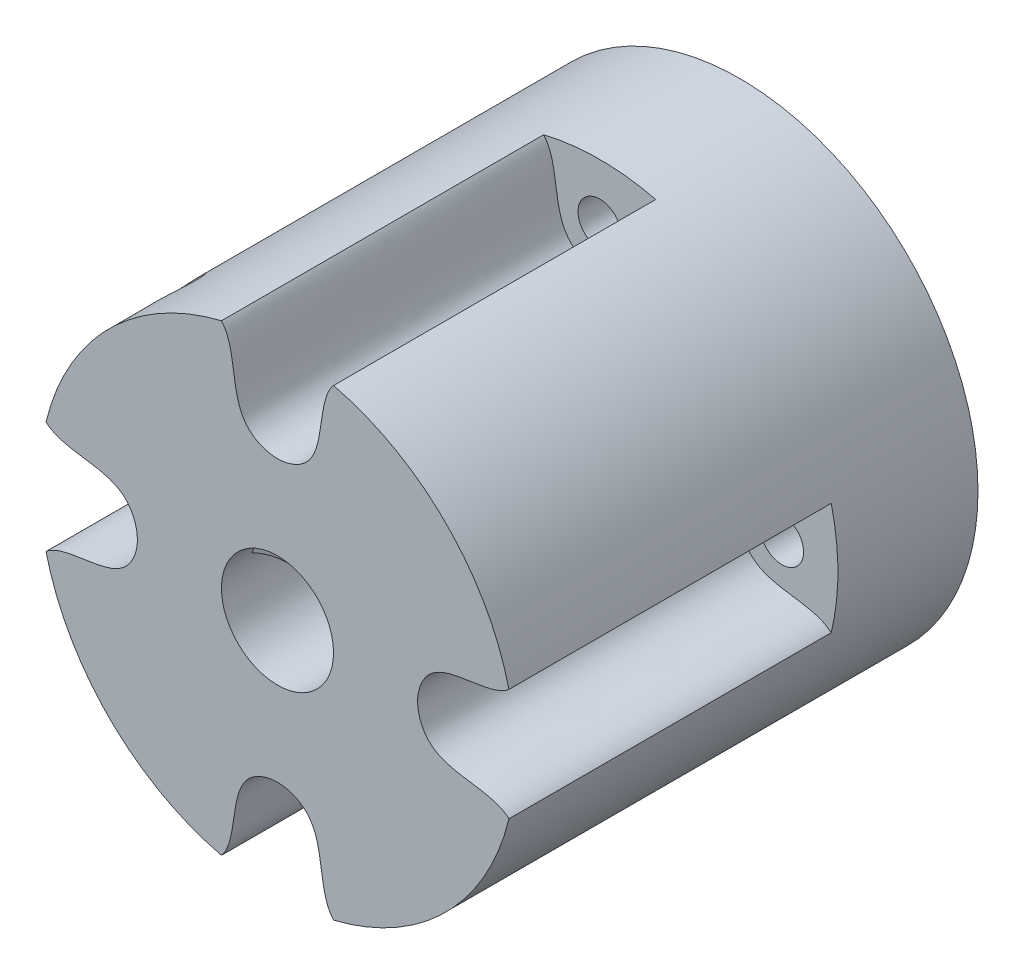
ISO-10303-21;
HEADER;
FILE_DESCRIPTION(('STEP AP214'),'2;1');
FILE_NAME('part.step','',(''),(''),'','','');
FILE_SCHEMA(('AUTOMOTIVE_DESIGN { 1 0 10303 214 1 1 1 1 }'));
ENDSEC;
DATA;
#1=APPLICATION_CONTEXT('core data for automotive mechanical design processes');
#2=APPLICATION_PROTOCOL_DEFINITION('international standard','automotive_design',2000,#1);
#3=PRODUCT_CONTEXT('',#1,'mechanical');
#4=PRODUCT('Part','Part','',(#3));
#5=PRODUCT_RELATED_PRODUCT_CATEGORY('part','',(#4));
#6=PRODUCT_DEFINITION_FORMATION('','',#4);
#7=PRODUCT_DEFINITION_CONTEXT('part definition',#1,'design');
#8=PRODUCT_DEFINITION('design','',#6,#7);
#9=PRODUCT_DEFINITION_SHAPE('','',#8);
#10=(LENGTH_UNIT() NAMED_UNIT(*) SI_UNIT(.MILLI.,.METRE.));
#11=(NAMED_UNIT(*) PLANE_ANGLE_UNIT() SI_UNIT($,.RADIAN.));
#12=(NAMED_UNIT(*) SI_UNIT($,.STERADIAN.) SOLID_ANGLE_UNIT());
#13=UNCERTAINTY_MEASURE_WITH_UNIT(LENGTH_MEASURE(1.E-05),#10,'distance_accuracy_value','');
#14=(GEOMETRIC_REPRESENTATION_CONTEXT(3) GLOBAL_UNCERTAINTY_ASSIGNED_CONTEXT((#13)) GLOBAL_UNIT_ASSIGNED_CONTEXT((#10,
#11,#12)) REPRESENTATION_CONTEXT('',''));
#15=CARTESIAN_POINT('',(0.,0.,0.));
#16=DIRECTION('',(0.,0.,1.));
#17=DIRECTION('',(1.,0.,0.));
#18=AXIS2_PLACEMENT_3D('',#15,#16,#17);
#19=CARTESIAN_POINT('',(0.,0.,9.99999999999999));
#20=DIRECTION('',(0.,0.,1.));
#21=DIRECTION('',(1.,0.,0.));
#22=AXIS2_PLACEMENT_3D('',#19,#20,#21);
#23=CYLINDRICAL_SURFACE('',#22,4.);
#24=CARTESIAN_POINT('',(0.,0.,33.));
#25=DIRECTION('',(0.,0.,1.));
#26=DIRECTION('',(1.,0.,0.));
#27=AXIS2_PLACEMENT_3D('',#24,#25,#26);
#28=CIRCLE('',#27,4.);
#29=CARTESIAN_POINT('',(4.,0.,33.));
#30=VERTEX_POINT('',#29);
#31=EDGE_CURVE('E174',#30,#30,#28,.T.);
#32=ORIENTED_EDGE('',*,*,#31,.T.);
#33=EDGE_LOOP('',(#32));
#34=FACE_BOUND('',#33,.T.);
#35=CARTESIAN_POINT('',(0.,0.,9.99999999999999));
#36=DIRECTION('',(0.,0.,1.));
#37=DIRECTION('',(1.,0.,0.));
#38=AXIS2_PLACEMENT_3D('',#35,#36,#37);
#39=CIRCLE('',#38,4.);
#40=CARTESIAN_POINT('',(4.,0.,9.99999999999999));
#41=VERTEX_POINT('',#40);
#42=EDGE_CURVE('E175',#41,#41,#39,.T.);
#43=ORIENTED_EDGE('',*,*,#42,.F.);
#44=EDGE_LOOP('',(#43));
#45=FACE_BOUND('',#44,.T.);
#46=CARTESIAN_POINT('',(0.,0.,21.9378221735089));
#47=DIRECTION('',(0.612372435695796,0.612372435695794,0.5));
#48=DIRECTION('',(-0.353553390593274,-0.353553390593273,0.866025403784439));
#49=AXIS2_PLACEMENT_3D('',#46,#47,#48);
#50=ELLIPSE('',#49,8.00000000000001,4.);
#51=CARTESIAN_POINT('',(-3.84418012791583,-1.10556734039,28.));
#52=VERTEX_POINT('',#51);
#53=CARTESIAN_POINT('',(-3.78081061074843,1.30593687659552,24.9689110867545));
#54=VERTEX_POINT('',#53);
#55=EDGE_CURVE('E11',#52,#54,#50,.F.);
#56=ORIENTED_EDGE('',*,*,#55,.F.);
#57=CARTESIAN_POINT('',(0.,0.,34.0621778264911));
#58=DIRECTION('',(0.612372435695795,0.612372435695793,-0.5));
#59=DIRECTION('',(0.353553390593275,0.353553390593273,0.866025403784439));
#60=AXIS2_PLACEMENT_3D('',#57,#58,#59);
#61=ELLIPSE('',#60,8.,4.);
#62=CARTESIAN_POINT('',(-3.78081061074843,1.30593687659552,31.0310889132455));
#63=VERTEX_POINT('',#62);
#64=EDGE_CURVE('E45',#63,#52,#61,.F.);
#65=ORIENTED_EDGE('',*,*,#64,.F.);
#66=CARTESIAN_POINT('',(0.,0.,31.0310889132455));
#67=DIRECTION('',(0.,0.,-1.));
#68=DIRECTION('',(-1.,0.,0.));
#69=AXIS2_PLACEMENT_3D('',#66,#67,#68);
#70=CIRCLE('',#69,4.);
#71=CARTESIAN_POINT('',(-1.30593687659552,3.78081061074843,31.0310889132455));
#72=VERTEX_POINT('',#71);
#73=EDGE_CURVE('E308',#72,#63,#70,.F.);
#74=ORIENTED_EDGE('',*,*,#73,.F.);
#75=CARTESIAN_POINT('',(0.,0.,34.0621778264911));
#76=DIRECTION('',(-0.612372435695796,-0.612372435695794,-0.5));
#77=DIRECTION('',(-0.353553390593274,-0.353553390593273,0.866025403784439));
#78=AXIS2_PLACEMENT_3D('',#75,#76,#77);
#79=ELLIPSE('',#78,8.00000000000001,4.);
#80=CARTESIAN_POINT('',(1.10556734038999,3.84418012791583,28.));
#81=VERTEX_POINT('',#80);
#82=EDGE_CURVE('E306',#81,#72,#79,.F.);
#83=ORIENTED_EDGE('',*,*,#82,.F.);
#84=CARTESIAN_POINT('',(0.,0.,21.9378221735089));
#85=DIRECTION('',(-0.612372435695796,-0.612372435695793,0.5));
#86=DIRECTION('',(0.353553390593275,0.353553390593273,0.866025403784439));
#87=AXIS2_PLACEMENT_3D('',#84,#85,#86);
#88=ELLIPSE('',#87,8.,4.);
#89=CARTESIAN_POINT('',(-1.30593687659552,3.78081061074843,24.9689110867545));
#90=VERTEX_POINT('',#89);
#91=EDGE_CURVE('E304',#90,#81,#88,.F.);
#92=ORIENTED_EDGE('',*,*,#91,.F.);
#93=CARTESIAN_POINT('',(0.,0.,24.9689110867545));
#94=DIRECTION('',(0.,0.,1.));
#95=DIRECTION('',(1.,0.,0.));
#96=AXIS2_PLACEMENT_3D('',#93,#94,#95);
#97=CIRCLE('',#96,4.);
#98=EDGE_CURVE('E302',#54,#90,#97,.F.);
#99=ORIENTED_EDGE('',*,*,#98,.F.);
#100=EDGE_LOOP('',(#56,#65,#74,#83,#92,#99));
#101=FACE_BOUND('',#100,.T.);
#102=ADVANCED_FACE('F36',(#34,#45,#101),#23,.F.);
#103=CARTESIAN_POINT('',(0.,0.,10.));
#104=DIRECTION('',(0.,0.,1.));
#105=DIRECTION('',(1.,0.,0.));
#106=AXIS2_PLACEMENT_3D('',#103,#104,#105);
#107=PLANE('',#106);
#108=CARTESIAN_POINT('',(4.,16.5227116418583,10.));
#109=CARTESIAN_POINT('',(2.81623304103462,15.1790975365494,10.));
#110=CARTESIAN_POINT('',(3.69602761665976,11.1900432660125,10.));
#111=CARTESIAN_POINT('',(0.,9.66895732992129,10.));
#112=CARTESIAN_POINT('',(-3.69602761665935,11.1900432660127,10.));
#113=CARTESIAN_POINT('',(-2.81623304103505,15.1790975365492,10.));
#114=CARTESIAN_POINT('',(-4.,16.5227116418583,10.));
#115=B_SPLINE_CURVE_WITH_KNOTS('',3,(#108,#109,#110,#111,#112,#113,#114),.UNSPECIFIED.,.F.,.F.,
(4,1,1,1,4),(0.,0.360911498122282,0.500000000000005,0.639088501877712,1.),.UNSPECIFIED.);
#116=CARTESIAN_POINT('',(4.,16.5227116418583,10.));
#117=VERTEX_POINT('',#116);
#118=CARTESIAN_POINT('',(-4.,16.5227116418583,10.));
#119=VERTEX_POINT('',#118);
#120=EDGE_CURVE('E217',#117,#119,#115,.T.);
#121=ORIENTED_EDGE('',*,*,#120,.F.);
#122=CARTESIAN_POINT('',(0.,0.,10.));
#123=DIRECTION('',(0.,0.,1.));
#124=DIRECTION('',(1.,0.,0.));
#125=AXIS2_PLACEMENT_3D('',#122,#123,#124);
#126=CIRCLE('',#125,17.);
#127=EDGE_CURVE('E299',#117,#119,#126,.T.);
#128=ORIENTED_EDGE('',*,*,#127,.T.);
#129=EDGE_LOOP('',(#121,#128));
#130=FACE_BOUND('',#129,.T.);
#131=CARTESIAN_POINT('',(1.36167772214882E-13,13.,10.));
#132=DIRECTION('',(0.,0.,1.));
#133=DIRECTION('',(1.,0.,0.));
#134=AXIS2_PLACEMENT_3D('',#131,#132,#133);
#135=CIRCLE('',#134,1.55);
#136=CARTESIAN_POINT('',(1.55000000000014,13.,10.));
#137=VERTEX_POINT('',#136);
#138=EDGE_CURVE('E271',#137,#137,#135,.T.);
#139=ORIENTED_EDGE('',*,*,#138,.F.);
#140=EDGE_LOOP('',(#139));
#141=FACE_BOUND('',#140,.T.);
#142=ADVANCED_FACE('F191',(#130,#141),#107,.T.);
#143=CARTESIAN_POINT('',(16.5227116418583,-4.00000000000006,10.));
#144=CARTESIAN_POINT('',(15.1790975365491,-2.8162330410354,10.));
#145=CARTESIAN_POINT('',(11.1900432660126,-3.69602761665968,10.));
#146=CARTESIAN_POINT('',(9.66895732992127,-1.77917576504871E-13,10.));
#147=CARTESIAN_POINT('',(11.1900432660126,3.69602761665935,10.));
#148=CARTESIAN_POINT('',(15.1790975365492,2.81623304103497,10.));
#149=CARTESIAN_POINT('',(16.5227116418583,3.99999999999994,10.));
#150=B_SPLINE_CURVE_WITH_KNOTS('',3,(#143,#144,#145,#146,#147,#148,#149),.UNSPECIFIED.,.F.,.F.,
(4,1,1,1,4),(0.,0.360911498122281,0.499999999999998,0.639088501877713,1.),.UNSPECIFIED.);
#151=CARTESIAN_POINT('',(16.5227116418583,-4.00000000000006,10.));
#152=VERTEX_POINT('',#151);
#153=CARTESIAN_POINT('',(16.5227116418583,3.99999999999994,10.));
#154=VERTEX_POINT('',#153);
#155=EDGE_CURVE('E58',#152,#154,#150,.T.);
#156=ORIENTED_EDGE('',*,*,#155,.F.);
#157=EDGE_CURVE('E296',#152,#154,#126,.T.);
#158=ORIENTED_EDGE('',*,*,#157,.T.);
#159=EDGE_LOOP('',(#156,#158));
#160=FACE_BOUND('',#159,.T.);
#161=CARTESIAN_POINT('',(13.,0.,10.));
#162=DIRECTION('',(0.,0.,1.));
#163=DIRECTION('',(1.,0.,0.));
#164=AXIS2_PLACEMENT_3D('',#161,#162,#163);
#165=CIRCLE('',#164,1.55);
#166=CARTESIAN_POINT('',(14.55,0.,10.));
#167=VERTEX_POINT('',#166);
#168=EDGE_CURVE('E276',#167,#167,#165,.T.);
#169=ORIENTED_EDGE('',*,*,#168,.F.);
#170=EDGE_LOOP('',(#169));
#171=FACE_BOUND('',#170,.T.);
#172=ADVANCED_FACE('F454',(#160,#171),#107,.T.);
#173=CARTESIAN_POINT('',(-4.00000000000012,-16.5227116418583,10.));
#174=CARTESIAN_POINT('',(-2.81623304103545,-15.1790975365491,10.));
#175=CARTESIAN_POINT('',(-3.69602761665971,-11.1900432660126,10.));
#176=CARTESIAN_POINT('',(-2.11019256304925E-13,-9.66895732992127,10.));
#177=CARTESIAN_POINT('',(3.69602761665931,-11.1900432660127,10.));
#178=CARTESIAN_POINT('',(2.81623304103493,-15.1790975365492,10.));
#179=CARTESIAN_POINT('',(3.99999999999988,-16.5227116418583,10.));
#180=B_SPLINE_CURVE_WITH_KNOTS('',3,(#173,#174,#175,#176,#177,#178,#179),.UNSPECIFIED.,.F.,.F.,
(4,1,1,1,4),(0.,0.360911498122281,0.499999999999998,0.639088501877713,1.),.UNSPECIFIED.);
#181=CARTESIAN_POINT('',(-4.00000000000012,-16.5227116418583,10.));
#182=VERTEX_POINT('',#181);
#183=CARTESIAN_POINT('',(3.99999999999989,-16.5227116418583,10.));
#184=VERTEX_POINT('',#183);
#185=EDGE_CURVE('E230',#182,#184,#180,.T.);
#186=ORIENTED_EDGE('',*,*,#185,.F.);
#187=EDGE_CURVE('E298',#182,#184,#126,.T.);
#188=ORIENTED_EDGE('',*,*,#187,.T.);
#189=EDGE_LOOP('',(#186,#188));
#190=FACE_BOUND('',#189,.T.);
#191=CARTESIAN_POINT('',(0.,-13.,10.));
#192=DIRECTION('',(0.,0.,1.));
#193=DIRECTION('',(1.,0.,0.));
#194=AXIS2_PLACEMENT_3D('',#191,#192,#193);
#195=CIRCLE('',#194,1.55);
#196=CARTESIAN_POINT('',(1.54999999999995,-13.,10.));
#197=VERTEX_POINT('',#196);
#198=EDGE_CURVE('E282',#197,#197,#195,.T.);
#199=ORIENTED_EDGE('',*,*,#198,.F.);
#200=EDGE_LOOP('',(#199));
#201=FACE_BOUND('',#200,.T.);
#202=ADVANCED_FACE('F443',(#190,#201),#107,.T.);
#203=CARTESIAN_POINT('',(0.,0.,10.));
#204=DIRECTION('',(0.,0.,-1.));
#205=DIRECTION('',(-1.,0.,0.));
#206=AXIS2_PLACEMENT_3D('',#203,#204,#205);
#207=CYLINDRICAL_SURFACE('',#206,17.);
#208=CARTESIAN_POINT('',(-13.0667611016534,10.8747300799752,28.));
#209=CARTESIAN_POINT('',(-13.0667590882622,10.8747334137986,27.9131301824057));
#210=CARTESIAN_POINT('',(-13.0620576590792,10.8803893083849,27.8262019867989));
#211=CARTESIAN_POINT('',(-13.0433333436767,10.9028280997072,27.6547529901778));
#212=CARTESIAN_POINT('',(-13.0293000250619,10.9196234495147,27.5702349940021));
#213=CARTESIAN_POINT('',(-12.9922051134211,10.9637325621549,27.4061142314592));
#214=CARTESIAN_POINT('',(-12.9691487976742,10.9910401765287,27.3265086234334));
#215=CARTESIAN_POINT('',(-12.9144932024255,11.0552084117274,27.1744230321982));
#216=CARTESIAN_POINT('',(-12.8828956910898,11.092067055269,27.1019415784034));
#217=CARTESIAN_POINT('',(-12.8117295803669,11.1741906485739,26.9659228250608));
#218=CARTESIAN_POINT('',(-12.7721396506212,11.2194780674527,26.9024102495174));
#219=CARTESIAN_POINT('',(-12.6859137841849,11.3168817831607,26.7863447829219));
#220=CARTESIAN_POINT('',(-12.6392775333631,11.3689983844272,26.7337923807326));
#221=CARTESIAN_POINT('',(-12.5399517001079,11.4784613254773,26.6410551539403));
#222=CARTESIAN_POINT('',(-12.4872517438756,11.5358165919617,26.6008919701049));
#223=CARTESIAN_POINT('',(-12.3771592719344,11.6538592323934,26.5342116933296));
#224=CARTESIAN_POINT('',(-12.3197668528147,11.7145465377459,26.5076943195874));
#225=CARTESIAN_POINT('',(-12.2019511500152,11.8372123406797,26.4691302458179));
#226=CARTESIAN_POINT('',(-12.1415368039958,11.89918674651,26.4570432303188));
#227=CARTESIAN_POINT('',(-12.0191880617054,12.0227566102491,26.4475582984812));
#228=CARTESIAN_POINT('',(-11.9572536987294,12.0843520764215,26.4501600606799));
#229=CARTESIAN_POINT('',(-11.8338326822137,12.2052384690106,26.4699459697004));
#230=CARTESIAN_POINT('',(-11.7723452451882,12.2645356991509,26.4870867645521));
#231=CARTESIAN_POINT('',(-11.6514633287782,12.379432972538,26.535396708547));
#232=CARTESIAN_POINT('',(-11.5920688726114,12.4350329747772,26.5665660132571));
#233=CARTESIAN_POINT('',(-11.4771165456914,12.5412094201445,26.6420961604233));
#234=CARTESIAN_POINT('',(-11.4215644392117,12.5917783634768,26.6864763145039));
#235=CARTESIAN_POINT('',(-11.3161551931119,12.6865939323336,26.7871543495165));
#236=CARTESIAN_POINT('',(-11.2662981921557,12.7308404039257,26.8434525205324));
#237=CARTESIAN_POINT('',(-11.1737384224804,12.8121577922177,26.9666125923005));
#238=CARTESIAN_POINT('',(-11.1310623432124,12.8492020161568,27.0335121821624));
#239=CARTESIAN_POINT('',(-11.0545299040505,12.9151046239464,27.1758450150321));
#240=CARTESIAN_POINT('',(-11.020673553683,12.9439629989553,27.2512782672572));
#241=CARTESIAN_POINT('',(-10.9629539056737,12.9928857635794,27.4085647776952));
#242=CARTESIAN_POINT('',(-10.9390922072189,13.0129487459181,27.4904190608147));
#243=CARTESIAN_POINT('',(-10.9022226558596,13.0438539179505,27.6582106902821));
#244=CARTESIAN_POINT('',(-10.8892145290381,13.0546963403482,27.7441479335284));
#245=CARTESIAN_POINT('',(-10.8745507286637,13.0669139047316,27.9173352566723));
#246=CARTESIAN_POINT('',(-10.8728544053145,13.0683229463364,28.004579505265));
#247=CARTESIAN_POINT('',(-10.8807678908433,13.0617347843647,28.1781947917249));
#248=CARTESIAN_POINT('',(-10.8903775731247,13.0537376861114,28.2645658393588));
#249=CARTESIAN_POINT('',(-10.9205281271703,13.0285243428857,28.4338305941013));
#250=CARTESIAN_POINT('',(-10.9410500139507,13.0113241091458,28.5167300716297));
#251=CARTESIAN_POINT('',(-10.9922834065162,12.9680693609882,28.6768775009244));
#252=CARTESIAN_POINT('',(-11.022995107311,12.9420146771165,28.7541253444969));
#253=CARTESIAN_POINT('',(-11.0936421460482,12.8815086412522,28.9010175228077));
#254=CARTESIAN_POINT('',(-11.1336034157729,12.8470336671242,28.9706396544291));
#255=CARTESIAN_POINT('',(-11.2213445152188,12.7704662695941,29.1000793523357));
#256=CARTESIAN_POINT('',(-11.2691245058387,12.72837368943,29.1598967168012));
#257=CARTESIAN_POINT('',(-11.371078530934,12.6373749973659,29.268209648322));
#258=CARTESIAN_POINT('',(-11.4252712173625,12.588448931299,29.3166709031471));
#259=CARTESIAN_POINT('',(-11.5381851226517,12.4850365249152,29.4006602442106));
#260=CARTESIAN_POINT('',(-11.5969062886472,12.4305502495054,29.4361884814004));
#261=CARTESIAN_POINT('',(-11.7169429023742,12.3174685788936,29.4932446964207));
#262=CARTESIAN_POINT('',(-11.7782543114315,12.2588794932962,29.5147936705626));
#263=CARTESIAN_POINT('',(-11.9016914607027,12.1390746879319,29.5433482427981));
#264=CARTESIAN_POINT('',(-11.9638171821257,12.077859028701,29.550354175889));
#265=CARTESIAN_POINT('',(-12.0868423216921,11.9547391980095,29.5496195325925));
#266=CARTESIAN_POINT('',(-12.1477453696532,11.8928383280425,29.5419323361343));
#267=CARTESIAN_POINT('',(-12.2668679327919,11.7699311060791,29.5121412384268));
#268=CARTESIAN_POINT('',(-12.325087444958,11.7089247550866,29.4900373209988));
#269=CARTESIAN_POINT('',(-12.4373081768212,11.5896538081966,29.4320543629902));
#270=CARTESIAN_POINT('',(-12.4913097749899,11.5313889664915,29.3961765600469));
#271=CARTESIAN_POINT('',(-12.5937633454461,11.4194085478829,29.3116701525058));
#272=CARTESIAN_POINT('',(-12.642215380566,11.3656929194748,29.2630416922917));
#273=CARTESIAN_POINT('',(-12.7325968408538,11.2643513765966,29.1542139025706));
#274=CARTESIAN_POINT('',(-12.7745029986683,11.2167472877917,29.0939749249911));
#275=CARTESIAN_POINT('',(-12.8506612119173,11.1294147805782,28.9637112696435));
#276=CARTESIAN_POINT('',(-12.8849114191084,11.0896882641761,28.8936842355316));
#277=CARTESIAN_POINT('',(-12.9450721194354,11.0194037669181,28.7456702848299));
#278=CARTESIAN_POINT('',(-12.9709643577253,10.9888658648753,28.6676664283053));
#279=CARTESIAN_POINT('',(-13.0137384910831,10.9381772075056,28.5060876336391));
#280=CARTESIAN_POINT('',(-13.0306306580102,10.9180146116551,28.4225191695605));
#281=CARTESIAN_POINT('',(-13.0508060856601,10.8938792162948,28.282055341044));
#282=CARTESIAN_POINT('',(-13.0567831460094,10.8867099375818,28.226061045402));
#283=CARTESIAN_POINT('',(-13.0647613045069,10.8771342892689,28.1133861232888));
#284=CARTESIAN_POINT('',(-13.066762415923,10.8747279037749,28.0567054991087));
#285=CARTESIAN_POINT('',(-13.0667611016534,10.8747300799752,28.));
#286=B_SPLINE_CURVE_WITH_KNOTS('',3,(#208,#209,#210,#211,#212,#213,#214,#215,#216,#217,#218,
#219,#220,#221,#222,#223,#224,#225,#226,#227,#228,#229,#230,#231,#232,#233,#234,#235,#236,#237,
#238,#239,#240,#241,#242,#243,#244,#245,#246,#247,#248,#249,#250,#251,#252,#253,#254,#255,#256,
#257,#258,#259,#260,#261,#262,#263,#264,#265,#266,#267,#268,#269,#270,#271,#272,#273,#274,#275,
#276,#277,#278,#279,#280,#281,#282,#283,#284,#285),.UNSPECIFIED.,.T.,.F.,(4,2,2,2,2,2,2,2,2,2,2,
2,2,2,2,2,2,2,2,2,2,2,2,2,2,2,2,2,2,2,2,2,2,2,2,2,2,2,4),(0.,0.260402394498925,
0.521096391038717,0.781638142839428,1.04212599951843,1.30331846800165,1.56452258411344,
1.82618040606755,2.08783284343413,2.34875255383486,2.60966655405044,2.86980529404974,
3.12994691888774,3.39047070205301,3.65100082707756,3.91247884715472,4.17395714965937,
4.43547727384614,4.69699079772046,4.95756404473294,5.21813437405785,5.47825284098682,
5.73837628627282,5.99923803259942,6.26010514778596,6.52175058674327,6.78339297173353,
7.04464146453124,7.30588393943612,7.5661791278156,7.82647460830234,8.08674670569683,
8.34701585599192,8.60819005608319,8.86942723900594,9.13123119538065,9.39273570908537,
9.562717613437,9.73269895054668),.UNSPECIFIED.);
#287=CARTESIAN_POINT('',(-13.0667611016534,10.8747300799752,28.));
#288=VERTEX_POINT('',#287);
#289=EDGE_CURVE('E162',#288,#288,#286,.T.);
#290=ORIENTED_EDGE('',*,*,#289,.T.);
#291=EDGE_LOOP('',(#290));
#292=FACE_BOUND('',#291,.T.);
#293=ORIENTED_EDGE('',*,*,#127,.F.);
#294=DIRECTION('',(0.,0.,-1.));
#295=VECTOR('',#294,1.);
#296=CARTESIAN_POINT('',(4.,16.5227116418583,33.));
#297=LINE('',#296,#295);
#298=CARTESIAN_POINT('',(4.,16.5227116418583,33.));
#299=VERTEX_POINT('',#298);
#300=EDGE_CURVE('E216',#299,#117,#297,.T.);
#301=ORIENTED_EDGE('',*,*,#300,.F.);
#302=CARTESIAN_POINT('',(0.,0.,33.));
#303=DIRECTION('',(0.,0.,1.));
#304=DIRECTION('',(1.,0.,0.));
#305=AXIS2_PLACEMENT_3D('',#302,#303,#304);
#306=CIRCLE('',#305,17.);
#307=CARTESIAN_POINT('',(16.5227116418583,3.99999999999994,33.));
#308=VERTEX_POINT('',#307);
#309=EDGE_CURVE('E210',#308,#299,#306,.T.);
#310=ORIENTED_EDGE('',*,*,#309,.F.);
#311=DIRECTION('',(0.,0.,-1.));
#312=VECTOR('',#311,1.);
#313=CARTESIAN_POINT('',(16.5227116418583,3.99999999999994,33.));
#314=LINE('',#313,#312);
#315=EDGE_CURVE('E250',#308,#154,#314,.T.);
#316=ORIENTED_EDGE('',*,*,#315,.T.);
#317=ORIENTED_EDGE('',*,*,#157,.F.);
#318=DIRECTION('',(0.,0.,-1.));
#319=VECTOR('',#318,1.);
#320=CARTESIAN_POINT('',(16.5227116418583,-4.00000000000006,33.));
#321=LINE('',#320,#319);
#322=CARTESIAN_POINT('',(16.5227116418583,-4.00000000000006,33.));
#323=VERTEX_POINT('',#322);
#324=EDGE_CURVE('E253',#323,#152,#321,.T.);
#325=ORIENTED_EDGE('',*,*,#324,.F.);
#326=CARTESIAN_POINT('',(0.,0.,33.));
#327=DIRECTION('',(0.,0.,1.));
#328=DIRECTION('',(1.,0.,0.));
#329=AXIS2_PLACEMENT_3D('',#326,#327,#328);
#330=CIRCLE('',#329,17.);
#331=CARTESIAN_POINT('',(3.99999999999989,-16.5227116418583,33.));
#332=VERTEX_POINT('',#331);
#333=EDGE_CURVE('E211',#332,#323,#330,.T.);
#334=ORIENTED_EDGE('',*,*,#333,.F.);
#335=DIRECTION('',(0.,0.,-1.));
#336=VECTOR('',#335,1.);
#337=CARTESIAN_POINT('',(3.99999999999989,-16.5227116418583,33.));
#338=LINE('',#337,#336);
#339=EDGE_CURVE('E256',#332,#184,#338,.T.);
#340=ORIENTED_EDGE('',*,*,#339,.T.);
#341=ORIENTED_EDGE('',*,*,#187,.F.);
#342=DIRECTION('',(0.,0.,-1.));
#343=VECTOR('',#342,1.);
#344=CARTESIAN_POINT('',(-4.00000000000012,-16.5227116418583,33.));
#345=LINE('',#344,#343);
#346=CARTESIAN_POINT('',(-4.00000000000012,-16.5227116418583,33.));
#347=VERTEX_POINT('',#346);
#348=EDGE_CURVE('E259',#347,#182,#345,.T.);
#349=ORIENTED_EDGE('',*,*,#348,.F.);
#350=CARTESIAN_POINT('',(0.,0.,33.));
#351=DIRECTION('',(0.,0.,1.));
#352=DIRECTION('',(1.,0.,0.));
#353=AXIS2_PLACEMENT_3D('',#350,#351,#352);
#354=CIRCLE('',#353,17.);
#355=CARTESIAN_POINT('',(-16.5227116418583,-3.99999999999982,33.));
#356=VERTEX_POINT('',#355);
#357=EDGE_CURVE('E572',#356,#347,#354,.T.);
#358=ORIENTED_EDGE('',*,*,#357,.F.);
#359=DIRECTION('',(0.,0.,-1.));
#360=VECTOR('',#359,1.);
#361=CARTESIAN_POINT('',(-16.5227116418583,-3.99999999999982,33.));
#362=LINE('',#361,#360);
#363=CARTESIAN_POINT('',(-16.5227116418583,-3.99999999999982,10.));
#364=VERTEX_POINT('',#363);
#365=EDGE_CURVE('E262',#356,#364,#362,.T.);
#366=ORIENTED_EDGE('',*,*,#365,.T.);
#367=CARTESIAN_POINT('',(-16.5227116418583,4.00000000000017,10.));
#368=VERTEX_POINT('',#367);
#369=EDGE_CURVE('E600',#368,#364,#126,.T.);
#370=ORIENTED_EDGE('',*,*,#369,.F.);
#371=DIRECTION('',(0.,0.,-1.));
#372=VECTOR('',#371,1.);
#373=CARTESIAN_POINT('',(-16.5227116418583,4.00000000000018,33.));
#374=LINE('',#373,#372);
#375=CARTESIAN_POINT('',(-16.5227116418583,4.00000000000018,33.));
#376=VERTEX_POINT('',#375);
#377=EDGE_CURVE('E265',#376,#368,#374,.T.);
#378=ORIENTED_EDGE('',*,*,#377,.F.);
#379=CARTESIAN_POINT('',(0.,0.,33.));
#380=DIRECTION('',(0.,0.,1.));
#381=DIRECTION('',(1.,0.,0.));
#382=AXIS2_PLACEMENT_3D('',#379,#380,#381);
#383=CIRCLE('',#382,17.);
#384=CARTESIAN_POINT('',(-4.,16.5227116418583,33.));
#385=VERTEX_POINT('',#384);
#386=EDGE_CURVE('E563',#385,#376,#383,.T.);
#387=ORIENTED_EDGE('',*,*,#386,.F.);
#388=DIRECTION('',(0.,0.,-1.));
#389=VECTOR('',#388,1.);
#390=CARTESIAN_POINT('',(-4.,16.5227116418583,33.));
#391=LINE('',#390,#389);
#392=EDGE_CURVE('E268',#385,#119,#391,.T.);
#393=ORIENTED_EDGE('',*,*,#392,.T.);
#394=EDGE_LOOP('',(#293,#301,#310,#316,#317,#325,#334,#340,#341,#349,#358,#366,#370,#378,#387,#393));
#395=FACE_BOUND('',#394,.T.);
#396=CARTESIAN_POINT('',(0.,0.,0.));
#397=DIRECTION('',(0.,0.,1.));
#398=DIRECTION('',(1.,0.,0.));
#399=AXIS2_PLACEMENT_3D('',#396,#397,#398);
#400=CIRCLE('',#399,17.);
#401=CARTESIAN_POINT('',(17.,0.,0.));
#402=VERTEX_POINT('',#401);
#403=EDGE_CURVE('E275',#402,#402,#400,.T.);
#404=ORIENTED_EDGE('',*,*,#403,.T.);
#405=EDGE_LOOP('',(#404));
#406=FACE_BOUND('',#405,.T.);
#407=ADVANCED_FACE('F38',(#292,#395,#406),#207,.T.);
#408=CARTESIAN_POINT('',(-16.5227116418583,4.00000000000018,10.));
#409=CARTESIAN_POINT('',(-15.1790975365491,2.81623304103551,10.));
#410=CARTESIAN_POINT('',(-11.1900432660126,3.69602761665975,10.));
#411=CARTESIAN_POINT('',(-9.66895732992127,2.49168766886161E-13,10.));
#412=CARTESIAN_POINT('',(-11.1900432660127,-3.69602761665927,10.));
#413=CARTESIAN_POINT('',(-15.1790975365492,-2.81623304103486,10.));
#414=CARTESIAN_POINT('',(-16.5227116418584,-3.99999999999983,10.));
#415=B_SPLINE_CURVE_WITH_KNOTS('',3,(#408,#409,#410,#411,#412,#413,#414),.UNSPECIFIED.,.F.,.F.,
(4,1,1,1,4),(0.,0.360911498122281,0.499999999999998,0.639088501877713,1.),.UNSPECIFIED.);
#416=EDGE_CURVE('E222',#368,#364,#415,.T.);
#417=ORIENTED_EDGE('',*,*,#416,.F.);
#418=ORIENTED_EDGE('',*,*,#369,.T.);
#419=EDGE_LOOP('',(#417,#418));
#420=FACE_BOUND('',#419,.T.);
#421=CARTESIAN_POINT('',(-13.,0.,10.));
#422=DIRECTION('',(0.,0.,1.));
#423=DIRECTION('',(1.,0.,0.));
#424=AXIS2_PLACEMENT_3D('',#421,#422,#423);
#425=CIRCLE('',#424,1.55);
#426=CARTESIAN_POINT('',(-11.45,0.,10.));
#427=VERTEX_POINT('',#426);
#428=EDGE_CURVE('E288',#427,#427,#425,.T.);
#429=ORIENTED_EDGE('',*,*,#428,.F.);
#430=EDGE_LOOP('',(#429));
#431=FACE_BOUND('',#430,.T.);
#432=ADVANCED_FACE('F435',(#420,#431),#107,.T.);
#433=CARTESIAN_POINT('',(0.,0.,0.));
#434=DIRECTION('',(0.,0.,1.));
#435=DIRECTION('',(1.,0.,0.));
#436=AXIS2_PLACEMENT_3D('',#433,#434,#435);
#437=PLANE('',#436);
#438=CARTESIAN_POINT('',(13.,0.,0.));
#439=DIRECTION('',(0.,0.,1.));
#440=DIRECTION('',(1.,0.,0.));
#441=AXIS2_PLACEMENT_3D('',#438,#439,#440);
#442=CIRCLE('',#441,1.55);
#443=CARTESIAN_POINT('',(14.55,0.,0.));
#444=VERTEX_POINT('',#443);
#445=EDGE_CURVE('E272',#444,#444,#442,.T.);
#446=ORIENTED_EDGE('',*,*,#445,.T.);
#447=EDGE_LOOP('',(#446));
#448=FACE_BOUND('',#447,.T.);
#449=CARTESIAN_POINT('',(0.,-13.,0.));
#450=DIRECTION('',(0.,0.,1.));
#451=DIRECTION('',(1.,0.,0.));
#452=AXIS2_PLACEMENT_3D('',#449,#450,#451);
#453=CIRCLE('',#452,1.55);
#454=CARTESIAN_POINT('',(1.54999999999995,-13.,0.));
#455=VERTEX_POINT('',#454);
#456=EDGE_CURVE('E279',#455,#455,#453,.T.);
#457=ORIENTED_EDGE('',*,*,#456,.T.);
#458=EDGE_LOOP('',(#457));
#459=FACE_BOUND('',#458,.T.);
#460=CARTESIAN_POINT('',(-13.,0.,0.));
#461=DIRECTION('',(0.,0.,1.));
#462=DIRECTION('',(1.,0.,0.));
#463=AXIS2_PLACEMENT_3D('',#460,#461,#462);
#464=CIRCLE('',#463,1.55);
#465=CARTESIAN_POINT('',(-11.45,0.,0.));
#466=VERTEX_POINT('',#465);
#467=EDGE_CURVE('E285',#466,#466,#464,.T.);
#468=ORIENTED_EDGE('',*,*,#467,.T.);
#469=EDGE_LOOP('',(#468));
#470=FACE_BOUND('',#469,.T.);
#471=CARTESIAN_POINT('',(1.36167772214882E-13,13.,0.));
#472=DIRECTION('',(0.,0.,1.));
#473=DIRECTION('',(1.,0.,0.));
#474=AXIS2_PLACEMENT_3D('',#471,#472,#473);
#475=CIRCLE('',#474,1.55);
#476=CARTESIAN_POINT('',(1.55000000000014,13.,0.));
#477=VERTEX_POINT('',#476);
#478=EDGE_CURVE('E291',#477,#477,#475,.T.);
#479=ORIENTED_EDGE('',*,*,#478,.T.);
#480=EDGE_LOOP('',(#479));
#481=FACE_BOUND('',#480,.T.);
#482=ORIENTED_EDGE('',*,*,#403,.F.);
#483=EDGE_LOOP('',(#482));
#484=FACE_BOUND('',#483,.T.);
#485=ADVANCED_FACE('F427',(#448,#459,#470,#481,#484),#437,.F.);
#486=CARTESIAN_POINT('',(1.36167772214882E-13,13.,0.));
#487=DIRECTION('',(0.,0.,1.));
#488=DIRECTION('',(1.,0.,0.));
#489=AXIS2_PLACEMENT_3D('',#486,#487,#488);
#490=CYLINDRICAL_SURFACE('',#489,1.55);
#491=ORIENTED_EDGE('',*,*,#478,.F.);
#492=EDGE_LOOP('',(#491));
#493=FACE_BOUND('',#492,.T.);
#494=ORIENTED_EDGE('',*,*,#138,.T.);
#495=EDGE_LOOP('',(#494));
#496=FACE_BOUND('',#495,.T.);
#497=ADVANCED_FACE('F419',(#493,#496),#490,.F.);
#498=CARTESIAN_POINT('',(-13.,0.,0.));
#499=DIRECTION('',(0.,0.,1.));
#500=DIRECTION('',(1.,0.,0.));
#501=AXIS2_PLACEMENT_3D('',#498,#499,#500);
#502=CYLINDRICAL_SURFACE('',#501,1.55);
#503=ORIENTED_EDGE('',*,*,#467,.F.);
#504=EDGE_LOOP('',(#503));
#505=FACE_BOUND('',#504,.T.);
#506=ORIENTED_EDGE('',*,*,#428,.T.);
#507=EDGE_LOOP('',(#506));
#508=FACE_BOUND('',#507,.T.);
#509=ADVANCED_FACE('F411',(#505,#508),#502,.F.);
#510=CARTESIAN_POINT('',(0.,-13.,0.));
#511=DIRECTION('',(0.,0.,1.));
#512=DIRECTION('',(1.,0.,0.));
#513=AXIS2_PLACEMENT_3D('',#510,#511,#512);
#514=CYLINDRICAL_SURFACE('',#513,1.55);
#515=ORIENTED_EDGE('',*,*,#456,.F.);
#516=EDGE_LOOP('',(#515));
#517=FACE_BOUND('',#516,.T.);
#518=ORIENTED_EDGE('',*,*,#198,.T.);
#519=EDGE_LOOP('',(#518));
#520=FACE_BOUND('',#519,.T.);
#521=ADVANCED_FACE('F402',(#517,#520),#514,.F.);
#522=CARTESIAN_POINT('',(13.,0.,0.));
#523=DIRECTION('',(0.,0.,1.));
#524=DIRECTION('',(1.,0.,0.));
#525=AXIS2_PLACEMENT_3D('',#522,#523,#524);
#526=CYLINDRICAL_SURFACE('',#525,1.55);
#527=ORIENTED_EDGE('',*,*,#445,.F.);
#528=EDGE_LOOP('',(#527));
#529=FACE_BOUND('',#528,.T.);
#530=ORIENTED_EDGE('',*,*,#168,.T.);
#531=EDGE_LOOP('',(#530));
#532=FACE_BOUND('',#531,.T.);
#533=ADVANCED_FACE('F393',(#529,#532),#526,.F.);
#534=CARTESIAN_POINT('',(4.,16.5227116418583,33.));
#535=CARTESIAN_POINT('',(2.81623304103462,15.1790975365494,33.));
#536=CARTESIAN_POINT('',(3.69602761665976,11.1900432660125,33.));
#537=CARTESIAN_POINT('',(0.,9.66895732992129,33.));
#538=CARTESIAN_POINT('',(-3.69602761665935,11.1900432660127,33.));
#539=CARTESIAN_POINT('',(-2.81623304103505,15.1790975365492,33.));
#540=CARTESIAN_POINT('',(-4.,16.5227116418583,33.));
#541=B_SPLINE_CURVE_WITH_KNOTS('',3,(#534,#535,#536,#537,#538,#539,#540),.UNSPECIFIED.,.F.,.F.,
(4,1,1,1,4),(0.,0.360911498122282,0.500000000000005,0.639088501877712,1.),.UNSPECIFIED.);
#542=DIRECTION('',(0.,0.,-1.));
#543=VECTOR('',#542,1.);
#544=SURFACE_OF_LINEAR_EXTRUSION('',#541,#543);
#545=ORIENTED_EDGE('',*,*,#120,.T.);
#546=ORIENTED_EDGE('',*,*,#392,.F.);
#547=EDGE_CURVE('E244',#299,#385,#541,.T.);
#548=ORIENTED_EDGE('',*,*,#547,.F.);
#549=ORIENTED_EDGE('',*,*,#300,.T.);
#550=EDGE_LOOP('',(#545,#546,#548,#549));
#551=FACE_BOUND('',#550,.T.);
#552=ADVANCED_FACE('F386',(#551),#544,.F.);
#553=CARTESIAN_POINT('',(-16.5227116418583,4.00000000000018,33.));
#554=CARTESIAN_POINT('',(-15.1790975365491,2.81623304103551,33.));
#555=CARTESIAN_POINT('',(-11.1900432660126,3.69602761665975,33.));
#556=CARTESIAN_POINT('',(-9.66895732992127,2.49168766886161E-13,33.));
#557=CARTESIAN_POINT('',(-11.1900432660127,-3.69602761665927,33.));
#558=CARTESIAN_POINT('',(-15.1790975365492,-2.81623304103486,33.));
#559=CARTESIAN_POINT('',(-16.5227116418584,-3.99999999999983,33.));
#560=B_SPLINE_CURVE_WITH_KNOTS('',3,(#553,#554,#555,#556,#557,#558,#559),.UNSPECIFIED.,.F.,.F.,
(4,1,1,1,4),(0.,0.360911498122281,0.499999999999998,0.639088501877713,1.),.UNSPECIFIED.);
#561=DIRECTION('',(0.,0.,-1.));
#562=VECTOR('',#561,1.);
#563=SURFACE_OF_LINEAR_EXTRUSION('',#560,#562);
#564=ORIENTED_EDGE('',*,*,#416,.T.);
#565=ORIENTED_EDGE('',*,*,#365,.F.);
#566=EDGE_CURVE('E567',#376,#356,#560,.T.);
#567=ORIENTED_EDGE('',*,*,#566,.F.);
#568=ORIENTED_EDGE('',*,*,#377,.T.);
#569=EDGE_LOOP('',(#564,#565,#567,#568));
#570=FACE_BOUND('',#569,.T.);
#571=ADVANCED_FACE('F379',(#570),#563,.F.);
#572=CARTESIAN_POINT('',(-4.00000000000012,-16.5227116418583,33.));
#573=CARTESIAN_POINT('',(-2.81623304103545,-15.1790975365491,33.));
#574=CARTESIAN_POINT('',(-3.69602761665971,-11.1900432660126,33.));
#575=CARTESIAN_POINT('',(-2.11019256304925E-13,-9.66895732992127,33.));
#576=CARTESIAN_POINT('',(3.69602761665931,-11.1900432660127,33.));
#577=CARTESIAN_POINT('',(2.81623304103493,-15.1790975365492,33.));
#578=CARTESIAN_POINT('',(3.99999999999988,-16.5227116418583,33.));
#579=B_SPLINE_CURVE_WITH_KNOTS('',3,(#572,#573,#574,#575,#576,#577,#578),.UNSPECIFIED.,.F.,.F.,
(4,1,1,1,4),(0.,0.360911498122281,0.499999999999998,0.639088501877713,1.),.UNSPECIFIED.);
#580=DIRECTION('',(0.,0.,-1.));
#581=VECTOR('',#580,1.);
#582=SURFACE_OF_LINEAR_EXTRUSION('',#579,#581);
#583=ORIENTED_EDGE('',*,*,#185,.T.);
#584=ORIENTED_EDGE('',*,*,#339,.F.);
#585=EDGE_CURVE('E576',#347,#332,#579,.T.);
#586=ORIENTED_EDGE('',*,*,#585,.F.);
#587=ORIENTED_EDGE('',*,*,#348,.T.);
#588=EDGE_LOOP('',(#583,#584,#586,#587));
#589=FACE_BOUND('',#588,.T.);
#590=ADVANCED_FACE('F200',(#589),#582,.F.);
#591=CARTESIAN_POINT('',(16.5227116418583,-4.00000000000006,33.));
#592=CARTESIAN_POINT('',(15.1790975365491,-2.8162330410354,33.));
#593=CARTESIAN_POINT('',(11.1900432660126,-3.69602761665968,33.));
#594=CARTESIAN_POINT('',(9.66895732992127,-1.77917576504871E-13,33.));
#595=CARTESIAN_POINT('',(11.1900432660126,3.69602761665935,33.));
#596=CARTESIAN_POINT('',(15.1790975365492,2.81623304103497,33.));
#597=CARTESIAN_POINT('',(16.5227116418583,3.99999999999994,33.));
#598=B_SPLINE_CURVE_WITH_KNOTS('',3,(#591,#592,#593,#594,#595,#596,#597),.UNSPECIFIED.,.F.,.F.,
(4,1,1,1,4),(0.,0.360911498122281,0.499999999999998,0.639088501877713,1.),.UNSPECIFIED.);
#599=DIRECTION('',(0.,0.,-1.));
#600=VECTOR('',#599,1.);
#601=SURFACE_OF_LINEAR_EXTRUSION('',#598,#600);
#602=ORIENTED_EDGE('',*,*,#155,.T.);
#603=ORIENTED_EDGE('',*,*,#315,.F.);
#604=EDGE_CURVE('E204',#323,#308,#598,.T.);
#605=ORIENTED_EDGE('',*,*,#604,.F.);
#606=ORIENTED_EDGE('',*,*,#324,.T.);
#607=EDGE_LOOP('',(#602,#603,#605,#606));
#608=FACE_BOUND('',#607,.T.);
#609=ADVANCED_FACE('F195',(#608),#601,.F.);
#610=CARTESIAN_POINT('',(0.,10.,33.));
#611=DIRECTION('',(0.,0.,-1.));
#612=DIRECTION('',(-1.,0.,0.));
#613=AXIS2_PLACEMENT_3D('',#610,#611,#612);
#614=PLANE('',#613);
#615=ORIENTED_EDGE('',*,*,#31,.F.);
#616=EDGE_LOOP('',(#615));
#617=FACE_BOUND('',#616,.T.);
#618=ORIENTED_EDGE('',*,*,#547,.T.);
#619=ORIENTED_EDGE('',*,*,#386,.T.);
#620=ORIENTED_EDGE('',*,*,#566,.T.);
#621=ORIENTED_EDGE('',*,*,#357,.T.);
#622=ORIENTED_EDGE('',*,*,#585,.T.);
#623=ORIENTED_EDGE('',*,*,#333,.T.);
#624=ORIENTED_EDGE('',*,*,#604,.T.);
#625=ORIENTED_EDGE('',*,*,#309,.T.);
#626=EDGE_LOOP('',(#618,#619,#620,#621,#622,#623,#624,#625));
#627=FACE_BOUND('',#626,.T.);
#628=ADVANCED_FACE('F187',(#617,#627),#614,.F.);
#629=CARTESIAN_POINT('',(0.,0.,9.99999999999999));
#630=DIRECTION('',(0.,0.,1.));
#631=DIRECTION('',(1.,0.,0.));
#632=AXIS2_PLACEMENT_3D('',#629,#630,#631);
#633=PLANE('',#632);
#634=ORIENTED_EDGE('',*,*,#42,.T.);
#635=EDGE_LOOP('',(#634));
#636=FACE_BOUND('',#635,.T.);
#637=ADVANCED_FACE('F182',(#636),#633,.T.);
#638=CARTESIAN_POINT('',(-1.4142135623731,1.4142135623731,28.));
#639=DIRECTION('',(-0.707106781186546,0.707106781186549,0.));
#640=DIRECTION('',(-0.707106781186549,-0.707106781186546,0.));
#641=AXIS2_PLACEMENT_3D('',#638,#639,#640);
#642=CYLINDRICAL_SURFACE('',#641,1.55);
#643=CARTESIAN_POINT('',(-4.94974746830583,4.94974746830584,28.));
#644=DIRECTION('',(-0.707106781186546,0.707106781186549,0.));
#645=DIRECTION('',(-0.707106781186549,-0.707106781186546,0.));
#646=AXIS2_PLACEMENT_3D('',#643,#644,#645);
#647=CIRCLE('',#646,1.55);
#648=CARTESIAN_POINT('',(-6.04576297914498,3.85373195746669,28.));
#649=VERTEX_POINT('',#648);
#650=EDGE_CURVE('E158',#649,#649,#647,.F.);
#651=ORIENTED_EDGE('',*,*,#650,.T.);
#652=EDGE_LOOP('',(#651));
#653=FACE_BOUND('',#652,.T.);
#654=ORIENTED_EDGE('',*,*,#289,.F.);
#655=EDGE_LOOP('',(#654));
#656=FACE_BOUND('',#655,.T.);
#657=ADVANCED_FACE('F177',(#653,#656),#642,.F.);
#658=CARTESIAN_POINT('',(-6.18718433538229,3.71231060122938,24.9689110867545));
#659=DIRECTION('',(0.612372435695796,0.612372435695794,0.5));
#660=DIRECTION('',(-0.707106781186546,0.707106781186549,0.));
#661=AXIS2_PLACEMENT_3D('',#658,#659,#660);
#662=PLANE('',#661);
#663=ORIENTED_EDGE('',*,*,#55,.T.);
#664=DIRECTION('',(0.707106781186546,-0.707106781186549,0.));
#665=VECTOR('',#664,1.);
#666=CARTESIAN_POINT('',(-6.18718433538229,3.71231060122938,24.9689110867545));
#667=LINE('',#666,#665);
#668=CARTESIAN_POINT('',(-6.18718433538229,3.71231060122938,24.9689110867545));
#669=VERTEX_POINT('',#668);
#670=EDGE_CURVE('E52',#669,#54,#667,.T.);
#671=ORIENTED_EDGE('',*,*,#670,.F.);
#672=DIRECTION('',(-0.353553390593274,-0.353553390593273,0.866025403784439));
#673=VECTOR('',#672,1.);
#674=CARTESIAN_POINT('',(-6.18718433538229,3.71231060122938,24.9689110867545));
#675=LINE('',#674,#673);
#676=CARTESIAN_POINT('',(-7.42462120245875,2.47487373415293,28.));
#677=VERTEX_POINT('',#676);
#678=EDGE_CURVE('E142',#669,#677,#675,.T.);
#679=ORIENTED_EDGE('',*,*,#678,.T.);
#680=DIRECTION('',(0.707106781186546,-0.707106781186549,0.));
#681=VECTOR('',#680,1.);
#682=CARTESIAN_POINT('',(-7.42462120245875,2.47487373415293,28.));
#683=LINE('',#682,#681);
#684=EDGE_CURVE('E153',#677,#52,#683,.T.);
#685=ORIENTED_EDGE('',*,*,#684,.T.);
#686=EDGE_LOOP('',(#663,#671,#679,#685));
#687=FACE_BOUND('',#686,.T.);
#688=ADVANCED_FACE('F152',(#687),#662,.T.);
#689=CARTESIAN_POINT('',(-7.42462120245875,2.47487373415293,28.));
#690=DIRECTION('',(0.612372435695795,0.612372435695793,-0.5));
#691=DIRECTION('',(-0.707106781186546,0.707106781186549,0.));
#692=AXIS2_PLACEMENT_3D('',#689,#690,#691);
#693=PLANE('',#692);
#694=ORIENTED_EDGE('',*,*,#64,.T.);
#695=ORIENTED_EDGE('',*,*,#684,.F.);
#696=DIRECTION('',(0.353553390593275,0.353553390593273,0.866025403784438));
#697=VECTOR('',#696,1.);
#698=CARTESIAN_POINT('',(-7.42462120245875,2.47487373415293,28.));
#699=LINE('',#698,#697);
#700=CARTESIAN_POINT('',(-6.18718433538229,3.71231060122938,31.0310889132455));
#701=VERTEX_POINT('',#700);
#702=EDGE_CURVE('E137',#677,#701,#699,.T.);
#703=ORIENTED_EDGE('',*,*,#702,.T.);
#704=DIRECTION('',(0.707106781186546,-0.707106781186549,0.));
#705=VECTOR('',#704,1.);
#706=CARTESIAN_POINT('',(-6.18718433538229,3.71231060122938,31.0310889132455));
#707=LINE('',#706,#705);
#708=EDGE_CURVE('E159',#701,#63,#707,.T.);
#709=ORIENTED_EDGE('',*,*,#708,.T.);
#710=EDGE_LOOP('',(#694,#695,#703,#709));
#711=FACE_BOUND('',#710,.T.);
#712=ADVANCED_FACE('F156',(#711),#693,.T.);
#713=CARTESIAN_POINT('',(-6.18718433538229,3.71231060122938,31.0310889132455));
#714=DIRECTION('',(0.,0.,-1.));
#715=DIRECTION('',(-1.,0.,0.));
#716=AXIS2_PLACEMENT_3D('',#713,#714,#715);
#717=PLANE('',#716);
#718=ORIENTED_EDGE('',*,*,#73,.T.);
#719=ORIENTED_EDGE('',*,*,#708,.F.);
#720=DIRECTION('',(0.707106781186549,0.707106781186546,0.));
#721=VECTOR('',#720,1.);
#722=CARTESIAN_POINT('',(-6.18718433538229,3.71231060122938,31.0310889132455));
#723=LINE('',#722,#721);
#724=CARTESIAN_POINT('',(-3.71231060122937,6.18718433538229,31.0310889132455));
#725=VERTEX_POINT('',#724);
#726=EDGE_CURVE('E144',#701,#725,#723,.T.);
#727=ORIENTED_EDGE('',*,*,#726,.T.);
#728=DIRECTION('',(0.707106781186546,-0.707106781186549,0.));
#729=VECTOR('',#728,1.);
#730=CARTESIAN_POINT('',(-3.71231060122937,6.18718433538229,31.0310889132455));
#731=LINE('',#730,#729);
#732=EDGE_CURVE('E164',#725,#72,#731,.T.);
#733=ORIENTED_EDGE('',*,*,#732,.T.);
#734=EDGE_LOOP('',(#718,#719,#727,#733));
#735=FACE_BOUND('',#734,.T.);
#736=ADVANCED_FACE('F312',(#735),#717,.T.);
#737=CARTESIAN_POINT('',(-3.71231060122937,6.18718433538229,31.0310889132455));
#738=DIRECTION('',(-0.612372435695796,-0.612372435695794,-0.5));
#739=DIRECTION('',(0.707106781186546,-0.707106781186549,0.));
#740=AXIS2_PLACEMENT_3D('',#737,#738,#739);
#741=PLANE('',#740);
#742=ORIENTED_EDGE('',*,*,#82,.T.);
#743=ORIENTED_EDGE('',*,*,#732,.F.);
#744=DIRECTION('',(0.353553390593274,0.353553390593273,-0.866025403784439));
#745=VECTOR('',#744,1.);
#746=CARTESIAN_POINT('',(-3.71231060122937,6.18718433538229,31.0310889132455));
#747=LINE('',#746,#745);
#748=CARTESIAN_POINT('',(-2.47487373415291,7.42462120245875,28.));
#749=VERTEX_POINT('',#748);
#750=EDGE_CURVE('E336',#725,#749,#747,.T.);
#751=ORIENTED_EDGE('',*,*,#750,.T.);
#752=DIRECTION('',(0.707106781186546,-0.707106781186549,0.));
#753=VECTOR('',#752,1.);
#754=CARTESIAN_POINT('',(-2.47487373415291,7.42462120245875,28.));
#755=LINE('',#754,#753);
#756=EDGE_CURVE('E328',#749,#81,#755,.T.);
#757=ORIENTED_EDGE('',*,*,#756,.T.);
#758=EDGE_LOOP('',(#742,#743,#751,#757));
#759=FACE_BOUND('',#758,.T.);
#760=ADVANCED_FACE('F339',(#759),#741,.T.);
#761=CARTESIAN_POINT('',(-2.47487373415291,7.42462120245875,28.));
#762=DIRECTION('',(-0.612372435695796,-0.612372435695793,0.5));
#763=DIRECTION('',(0.707106781186546,-0.707106781186549,0.));
#764=AXIS2_PLACEMENT_3D('',#761,#762,#763);
#765=PLANE('',#764);
#766=ORIENTED_EDGE('',*,*,#91,.T.);
#767=ORIENTED_EDGE('',*,*,#756,.F.);
#768=DIRECTION('',(-0.353553390593275,-0.353553390593273,-0.866025403784439));
#769=VECTOR('',#768,1.);
#770=CARTESIAN_POINT('',(-2.47487373415291,7.42462120245875,28.));
#771=LINE('',#770,#769);
#772=CARTESIAN_POINT('',(-3.71231060122937,6.18718433538229,24.9689110867545));
#773=VERTEX_POINT('',#772);
#774=EDGE_CURVE('E327',#749,#773,#771,.T.);
#775=ORIENTED_EDGE('',*,*,#774,.T.);
#776=DIRECTION('',(0.707106781186546,-0.707106781186549,0.));
#777=VECTOR('',#776,1.);
#778=CARTESIAN_POINT('',(-3.71231060122937,6.18718433538229,24.9689110867545));
#779=LINE('',#778,#777);
#780=EDGE_CURVE('E321',#773,#90,#779,.T.);
#781=ORIENTED_EDGE('',*,*,#780,.T.);
#782=EDGE_LOOP('',(#766,#767,#775,#781));
#783=FACE_BOUND('',#782,.T.);
#784=ADVANCED_FACE('F323',(#783),#765,.T.);
#785=CARTESIAN_POINT('',(-3.71231060122937,6.18718433538229,24.9689110867545));
#786=DIRECTION('',(0.,0.,1.));
#787=DIRECTION('',(1.,0.,0.));
#788=AXIS2_PLACEMENT_3D('',#785,#786,#787);
#789=PLANE('',#788);
#790=ORIENTED_EDGE('',*,*,#98,.T.);
#791=ORIENTED_EDGE('',*,*,#780,.F.);
#792=DIRECTION('',(-0.707106781186549,-0.707106781186546,0.));
#793=VECTOR('',#792,1.);
#794=CARTESIAN_POINT('',(-3.71231060122937,6.18718433538229,24.9689110867545));
#795=LINE('',#794,#793);
#796=EDGE_CURVE('E331',#773,#669,#795,.T.);
#797=ORIENTED_EDGE('',*,*,#796,.T.);
#798=ORIENTED_EDGE('',*,*,#670,.T.);
#799=EDGE_LOOP('',(#790,#791,#797,#798));
#800=FACE_BOUND('',#799,.T.);
#801=ADVANCED_FACE('F320',(#800),#789,.T.);
#802=CARTESIAN_POINT('',(-4.94974746830582,4.94974746830584,0.));
#803=DIRECTION('',(-0.707106781186546,0.707106781186549,0.));
#804=DIRECTION('',(-0.707106781186549,-0.707106781186546,0.));
#805=AXIS2_PLACEMENT_3D('',#802,#803,#804);
#806=PLANE('',#805);
#807=ORIENTED_EDGE('',*,*,#678,.F.);
#808=ORIENTED_EDGE('',*,*,#796,.F.);
#809=ORIENTED_EDGE('',*,*,#774,.F.);
#810=ORIENTED_EDGE('',*,*,#750,.F.);
#811=ORIENTED_EDGE('',*,*,#726,.F.);
#812=ORIENTED_EDGE('',*,*,#702,.F.);
#813=EDGE_LOOP('',(#807,#808,#809,#810,#811,#812));
#814=FACE_BOUND('',#813,.T.);
#815=ORIENTED_EDGE('',*,*,#650,.F.);
#816=EDGE_LOOP('',(#815));
#817=FACE_BOUND('',#816,.T.);
#818=ADVANCED_FACE('F139',(#814,#817),#806,.F.);
#819=CLOSED_SHELL('',(#102,#142,#172,#202,#407,#432,#485,#497,#509,#521,#533,#552,#571,#590,
#609,#628,#637,#657,#688,#712,#736,#760,#784,#801,#818));
#820=MANIFOLD_SOLID_BREP('B2',#819);
#821=ADVANCED_BREP_SHAPE_REPRESENTATION('',(#18,#820),#14);
#822=SHAPE_DEFINITION_REPRESENTATION(#9,#821);
ENDSEC;
END-ISO-10303-21;
